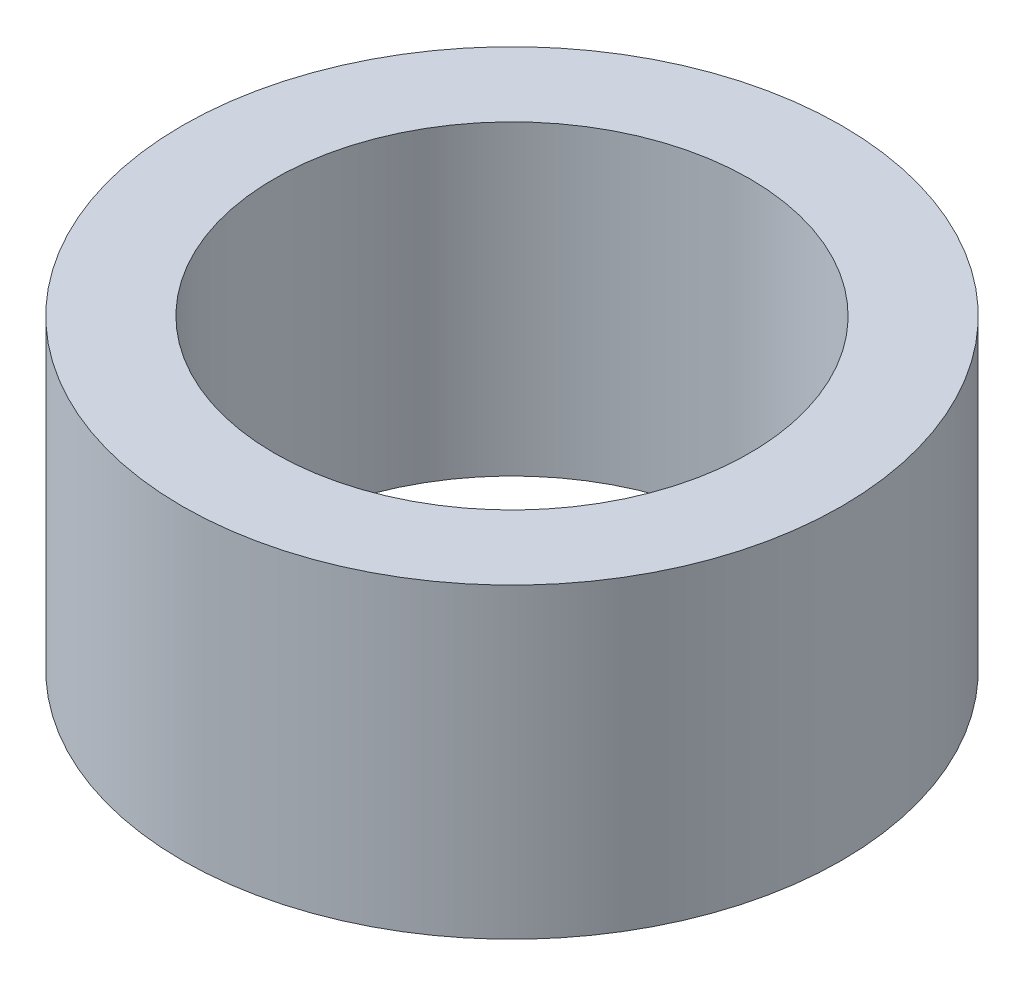
ISO-10303-21;
HEADER;
FILE_DESCRIPTION(('STEP AP214'),'2;1');
FILE_NAME('part.step','',(''),(''),'','','');
FILE_SCHEMA(('AUTOMOTIVE_DESIGN { 1 0 10303 214 1 1 1 1 }'));
ENDSEC;
DATA;
#1=APPLICATION_CONTEXT('core data for automotive mechanical design processes');
#2=APPLICATION_PROTOCOL_DEFINITION('international standard','automotive_design',2000,#1);
#3=PRODUCT_CONTEXT('',#1,'mechanical');
#4=PRODUCT('Part','Part','',(#3));
#5=PRODUCT_RELATED_PRODUCT_CATEGORY('part','',(#4));
#6=PRODUCT_DEFINITION_FORMATION('','',#4);
#7=PRODUCT_DEFINITION_CONTEXT('part definition',#1,'design');
#8=PRODUCT_DEFINITION('design','',#6,#7);
#9=PRODUCT_DEFINITION_SHAPE('','',#8);
#10=(LENGTH_UNIT() NAMED_UNIT(*) SI_UNIT(.MILLI.,.METRE.));
#11=(NAMED_UNIT(*) PLANE_ANGLE_UNIT() SI_UNIT($,.RADIAN.));
#12=(NAMED_UNIT(*) SI_UNIT($,.STERADIAN.) SOLID_ANGLE_UNIT());
#13=UNCERTAINTY_MEASURE_WITH_UNIT(LENGTH_MEASURE(1.E-05),#10,'distance_accuracy_value','');
#14=(GEOMETRIC_REPRESENTATION_CONTEXT(3) GLOBAL_UNCERTAINTY_ASSIGNED_CONTEXT((#13)) GLOBAL_UNIT_ASSIGNED_CONTEXT((#10,
#11,#12)) REPRESENTATION_CONTEXT('',''));
#15=CARTESIAN_POINT('',(0.,0.,0.));
#16=DIRECTION('',(0.,0.,1.));
#17=DIRECTION('',(1.,0.,0.));
#18=AXIS2_PLACEMENT_3D('',#15,#16,#17);
#19=CARTESIAN_POINT('',(0.,20.,0.));
#20=DIRECTION('',(0.,1.,0.));
#21=DIRECTION('',(0.,0.,1.));
#22=AXIS2_PLACEMENT_3D('',#19,#20,#21);
#23=PLANE('',#22);
#24=CARTESIAN_POINT('',(0.,20.,0.));
#25=DIRECTION('',(0.,1.,0.));
#26=DIRECTION('',(0.,0.,1.));
#27=AXIS2_PLACEMENT_3D('',#24,#25,#26);
#28=CIRCLE('',#27,21.5);
#29=CARTESIAN_POINT('',(0.,20.,21.5));
#30=VERTEX_POINT('',#29);
#31=EDGE_CURVE('E10',#30,#30,#28,.T.);
#32=ORIENTED_EDGE('',*,*,#31,.T.);
#33=EDGE_LOOP('',(#32));
#34=FACE_BOUND('',#33,.T.);
#35=CARTESIAN_POINT('',(0.,20.,0.));
#36=DIRECTION('',(0.,1.,0.));
#37=DIRECTION('',(0.,0.,1.));
#38=AXIS2_PLACEMENT_3D('',#35,#36,#37);
#39=CIRCLE('',#38,15.5);
#40=CARTESIAN_POINT('',(0.,20.,15.5));
#41=VERTEX_POINT('',#40);
#42=EDGE_CURVE('E50',#41,#41,#39,.T.);
#43=ORIENTED_EDGE('',*,*,#42,.F.);
#44=EDGE_LOOP('',(#43));
#45=FACE_BOUND('',#44,.T.);
#46=ADVANCED_FACE('F39',(#34,#45),#23,.T.);
#47=CARTESIAN_POINT('',(0.,0.,0.));
#48=DIRECTION('',(0.,1.,0.));
#49=DIRECTION('',(0.,0.,1.));
#50=AXIS2_PLACEMENT_3D('',#47,#48,#49);
#51=PLANE('',#50);
#52=CARTESIAN_POINT('',(0.,0.,0.));
#53=DIRECTION('',(0.,1.,0.));
#54=DIRECTION('',(0.,0.,1.));
#55=AXIS2_PLACEMENT_3D('',#52,#53,#54);
#56=CIRCLE('',#55,21.5);
#57=CARTESIAN_POINT('',(0.,0.,21.5));
#58=VERTEX_POINT('',#57);
#59=EDGE_CURVE('E43',#58,#58,#56,.T.);
#60=ORIENTED_EDGE('',*,*,#59,.F.);
#61=EDGE_LOOP('',(#60));
#62=FACE_BOUND('',#61,.T.);
#63=CARTESIAN_POINT('',(0.,0.,0.));
#64=DIRECTION('',(0.,1.,0.));
#65=DIRECTION('',(0.,0.,1.));
#66=AXIS2_PLACEMENT_3D('',#63,#64,#65);
#67=CIRCLE('',#66,15.5);
#68=CARTESIAN_POINT('',(0.,0.,15.5));
#69=VERTEX_POINT('',#68);
#70=EDGE_CURVE('E52',#69,#69,#67,.T.);
#71=ORIENTED_EDGE('',*,*,#70,.T.);
#72=EDGE_LOOP('',(#71));
#73=FACE_BOUND('',#72,.T.);
#74=ADVANCED_FACE('F62',(#62,#73),#51,.F.);
#75=CARTESIAN_POINT('',(0.,20.,0.));
#76=DIRECTION('',(0.,-1.,0.));
#77=DIRECTION('',(0.,0.,-1.));
#78=AXIS2_PLACEMENT_3D('',#75,#76,#77);
#79=CYLINDRICAL_SURFACE('',#78,21.5);
#80=ORIENTED_EDGE('',*,*,#31,.F.);
#81=EDGE_LOOP('',(#80));
#82=FACE_BOUND('',#81,.T.);
#83=ORIENTED_EDGE('',*,*,#59,.T.);
#84=EDGE_LOOP('',(#83));
#85=FACE_BOUND('',#84,.T.);
#86=ADVANCED_FACE('F41',(#82,#85),#79,.T.);
#87=CARTESIAN_POINT('',(0.,20.,0.));
#88=DIRECTION('',(0.,-1.,0.));
#89=DIRECTION('',(0.,0.,-1.));
#90=AXIS2_PLACEMENT_3D('',#87,#88,#89);
#91=CYLINDRICAL_SURFACE('',#90,15.5);
#92=ORIENTED_EDGE('',*,*,#42,.T.);
#93=EDGE_LOOP('',(#92));
#94=FACE_BOUND('',#93,.T.);
#95=ORIENTED_EDGE('',*,*,#70,.F.);
#96=EDGE_LOOP('',(#95));
#97=FACE_BOUND('',#96,.T.);
#98=ADVANCED_FACE('F58',(#94,#97),#91,.F.);
#99=CLOSED_SHELL('',(#46,#74,#86,#98));
#100=MANIFOLD_SOLID_BREP('B2',#99);
#101=ADVANCED_BREP_SHAPE_REPRESENTATION('',(#18,#100),#14);
#102=SHAPE_DEFINITION_REPRESENTATION(#9,#101);
ENDSEC;
END-ISO-10303-21;
